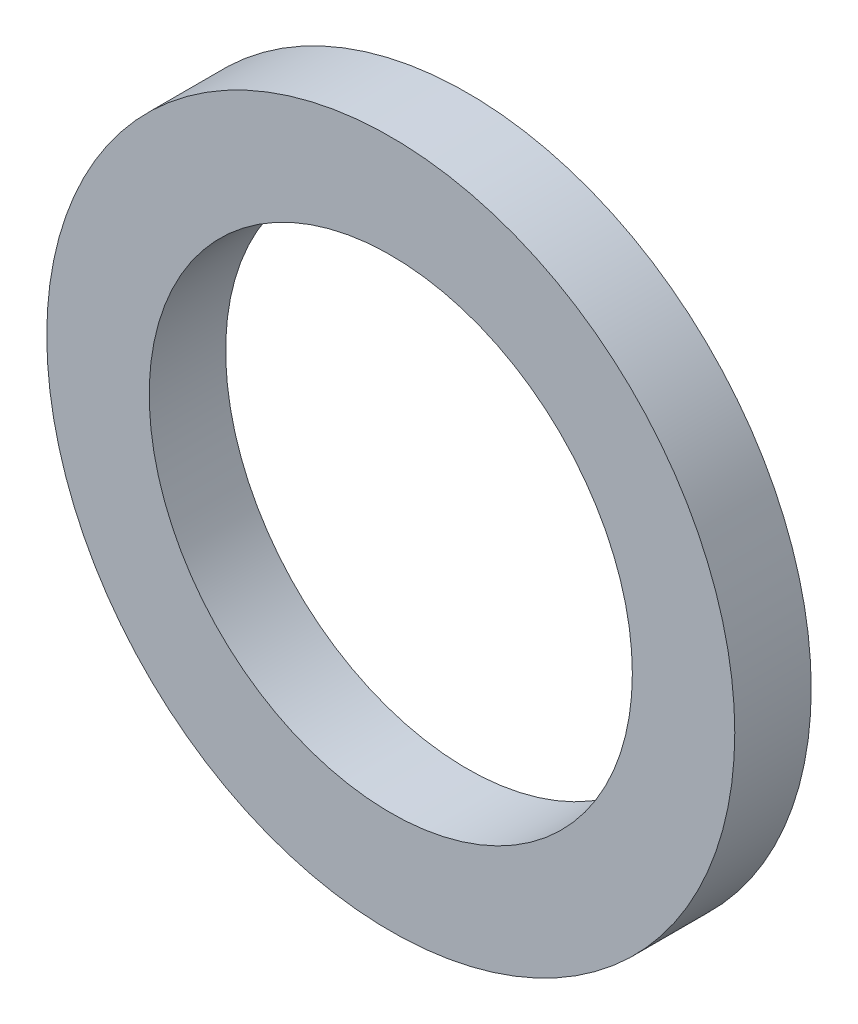
ISO-10303-21;
HEADER;
FILE_DESCRIPTION(('STEP AP214'),'2;1');
FILE_NAME('part.step','',(''),(''),'','','');
FILE_SCHEMA(('AUTOMOTIVE_DESIGN { 1 0 10303 214 1 1 1 1 }'));
ENDSEC;
DATA;
#1=APPLICATION_CONTEXT('core data for automotive mechanical design processes');
#2=APPLICATION_PROTOCOL_DEFINITION('international standard','automotive_design',2000,#1);
#3=PRODUCT_CONTEXT('',#1,'mechanical');
#4=PRODUCT('Part','Part','',(#3));
#5=PRODUCT_RELATED_PRODUCT_CATEGORY('part','',(#4));
#6=PRODUCT_DEFINITION_FORMATION('','',#4);
#7=PRODUCT_DEFINITION_CONTEXT('part definition',#1,'design');
#8=PRODUCT_DEFINITION('design','',#6,#7);
#9=PRODUCT_DEFINITION_SHAPE('','',#8);
#10=(LENGTH_UNIT() NAMED_UNIT(*) SI_UNIT(.MILLI.,.METRE.));
#11=(NAMED_UNIT(*) PLANE_ANGLE_UNIT() SI_UNIT($,.RADIAN.));
#12=(NAMED_UNIT(*) SI_UNIT($,.STERADIAN.) SOLID_ANGLE_UNIT());
#13=UNCERTAINTY_MEASURE_WITH_UNIT(LENGTH_MEASURE(1.E-05),#10,'distance_accuracy_value','');
#14=(GEOMETRIC_REPRESENTATION_CONTEXT(3) GLOBAL_UNCERTAINTY_ASSIGNED_CONTEXT((#13)) GLOBAL_UNIT_ASSIGNED_CONTEXT((#10,
#11,#12)) REPRESENTATION_CONTEXT('',''));
#15=CARTESIAN_POINT('',(0.,0.,0.));
#16=DIRECTION('',(0.,0.,1.));
#17=DIRECTION('',(1.,0.,0.));
#18=AXIS2_PLACEMENT_3D('',#15,#16,#17);
#19=CARTESIAN_POINT('',(0.,0.,1.5875));
#20=DIRECTION('',(0.,0.,1.));
#21=DIRECTION('',(1.,0.,0.));
#22=AXIS2_PLACEMENT_3D('',#19,#20,#21);
#23=PLANE('',#22);
#24=CARTESIAN_POINT('',(0.,0.,1.5875));
#25=DIRECTION('',(0.,0.,1.));
#26=DIRECTION('',(1.,0.,0.));
#27=AXIS2_PLACEMENT_3D('',#24,#25,#26);
#28=CIRCLE('',#27,7.14375);
#29=CARTESIAN_POINT('',(7.14375,0.,1.5875));
#30=VERTEX_POINT('',#29);
#31=EDGE_CURVE('E10',#30,#30,#28,.T.);
#32=ORIENTED_EDGE('',*,*,#31,.T.);
#33=EDGE_LOOP('',(#32));
#34=FACE_BOUND('',#33,.T.);
#35=CARTESIAN_POINT('',(0.,0.,1.5875));
#36=DIRECTION('',(0.,0.,1.));
#37=DIRECTION('',(1.,0.,0.));
#38=AXIS2_PLACEMENT_3D('',#35,#36,#37);
#39=CIRCLE('',#38,5.0165);
#40=CARTESIAN_POINT('',(5.0165,0.,1.5875));
#41=VERTEX_POINT('',#40);
#42=EDGE_CURVE('E56',#41,#41,#39,.T.);
#43=ORIENTED_EDGE('',*,*,#42,.F.);
#44=EDGE_LOOP('',(#43));
#45=FACE_BOUND('',#44,.T.);
#46=ADVANCED_FACE('F43',(#34,#45),#23,.T.);
#47=CARTESIAN_POINT('',(0.,0.,0.));
#48=DIRECTION('',(0.,0.,1.));
#49=DIRECTION('',(1.,0.,0.));
#50=AXIS2_PLACEMENT_3D('',#47,#48,#49);
#51=PLANE('',#50);
#52=CARTESIAN_POINT('',(0.,0.,0.));
#53=DIRECTION('',(0.,0.,1.));
#54=DIRECTION('',(1.,0.,0.));
#55=AXIS2_PLACEMENT_3D('',#52,#53,#54);
#56=CIRCLE('',#55,7.14375);
#57=CARTESIAN_POINT('',(7.14375,0.,0.));
#58=VERTEX_POINT('',#57);
#59=EDGE_CURVE('E47',#58,#58,#56,.T.);
#60=ORIENTED_EDGE('',*,*,#59,.F.);
#61=EDGE_LOOP('',(#60));
#62=FACE_BOUND('',#61,.T.);
#63=CARTESIAN_POINT('',(0.,0.,0.));
#64=DIRECTION('',(0.,0.,1.));
#65=DIRECTION('',(1.,0.,0.));
#66=AXIS2_PLACEMENT_3D('',#63,#64,#65);
#67=CIRCLE('',#66,5.0165);
#68=CARTESIAN_POINT('',(5.0165,0.,0.));
#69=VERTEX_POINT('',#68);
#70=EDGE_CURVE('E58',#69,#69,#67,.T.);
#71=ORIENTED_EDGE('',*,*,#70,.T.);
#72=EDGE_LOOP('',(#71));
#73=FACE_BOUND('',#72,.T.);
#74=ADVANCED_FACE('F70',(#62,#73),#51,.F.);
#75=CARTESIAN_POINT('',(0.,0.,1.5875));
#76=DIRECTION('',(0.,0.,-1.));
#77=DIRECTION('',(-1.,0.,0.));
#78=AXIS2_PLACEMENT_3D('',#75,#76,#77);
#79=CYLINDRICAL_SURFACE('',#78,7.14375);
#80=ORIENTED_EDGE('',*,*,#31,.F.);
#81=EDGE_LOOP('',(#80));
#82=FACE_BOUND('',#81,.T.);
#83=ORIENTED_EDGE('',*,*,#59,.T.);
#84=EDGE_LOOP('',(#83));
#85=FACE_BOUND('',#84,.T.);
#86=ADVANCED_FACE('F45',(#82,#85),#79,.T.);
#87=CARTESIAN_POINT('',(0.,0.,1.5875));
#88=DIRECTION('',(0.,0.,-1.));
#89=DIRECTION('',(-1.,0.,0.));
#90=AXIS2_PLACEMENT_3D('',#87,#88,#89);
#91=CYLINDRICAL_SURFACE('',#90,5.0165);
#92=ORIENTED_EDGE('',*,*,#42,.T.);
#93=EDGE_LOOP('',(#92));
#94=FACE_BOUND('',#93,.T.);
#95=ORIENTED_EDGE('',*,*,#70,.F.);
#96=EDGE_LOOP('',(#95));
#97=FACE_BOUND('',#96,.T.);
#98=ADVANCED_FACE('F66',(#94,#97),#91,.F.);
#99=CLOSED_SHELL('',(#46,#74,#86,#98));
#100=MANIFOLD_SOLID_BREP('B2',#99);
#101=ADVANCED_BREP_SHAPE_REPRESENTATION('',(#18,#100),#14);
#102=SHAPE_DEFINITION_REPRESENTATION(#9,#101);
ENDSEC;
END-ISO-10303-21;
